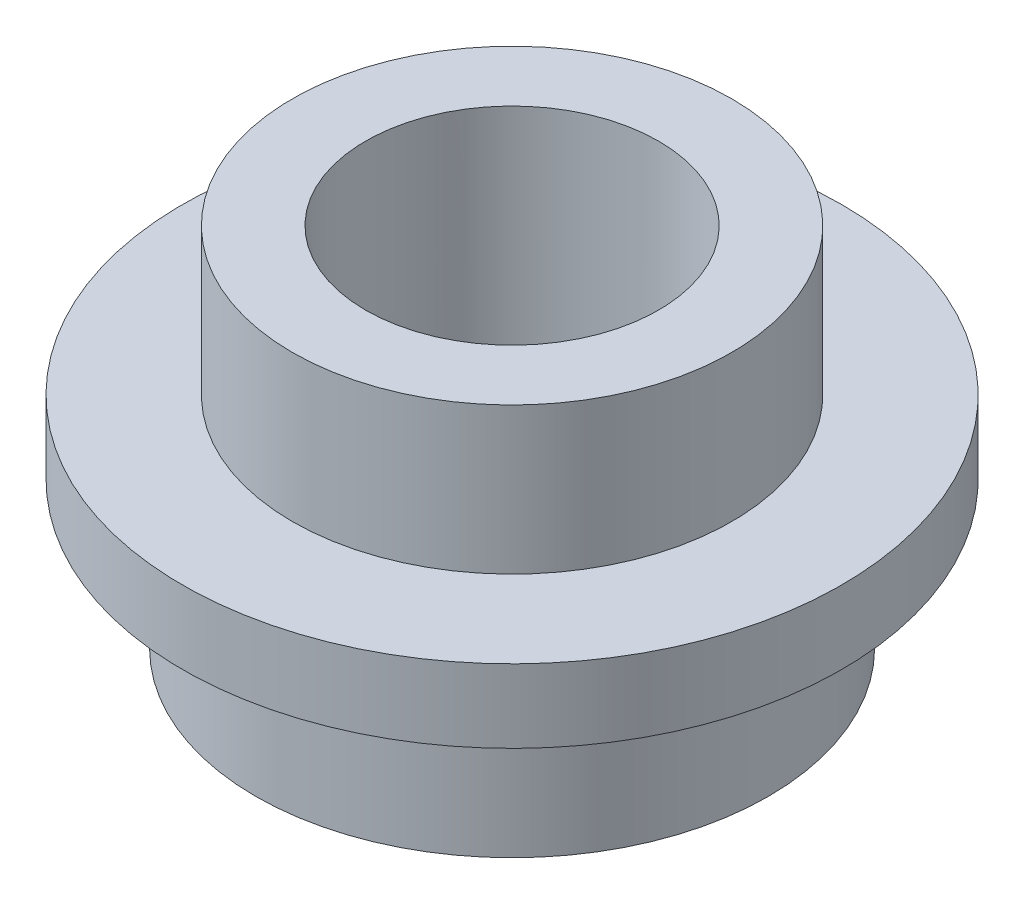
ISO-10303-21;
HEADER;
FILE_DESCRIPTION(('STEP AP214'),'2;1');
FILE_NAME('part.step','',(''),(''),'','','');
FILE_SCHEMA(('AUTOMOTIVE_DESIGN { 1 0 10303 214 1 1 1 1 }'));
ENDSEC;
DATA;
#1=APPLICATION_CONTEXT('core data for automotive mechanical design processes');
#2=APPLICATION_PROTOCOL_DEFINITION('international standard','automotive_design',2000,#1);
#3=PRODUCT_CONTEXT('',#1,'mechanical');
#4=PRODUCT('Part','Part','',(#3));
#5=PRODUCT_RELATED_PRODUCT_CATEGORY('part','',(#4));
#6=PRODUCT_DEFINITION_FORMATION('','',#4);
#7=PRODUCT_DEFINITION_CONTEXT('part definition',#1,'design');
#8=PRODUCT_DEFINITION('design','',#6,#7);
#9=PRODUCT_DEFINITION_SHAPE('','',#8);
#10=(LENGTH_UNIT() NAMED_UNIT(*) SI_UNIT(.MILLI.,.METRE.));
#11=(NAMED_UNIT(*) PLANE_ANGLE_UNIT() SI_UNIT($,.RADIAN.));
#12=(NAMED_UNIT(*) SI_UNIT($,.STERADIAN.) SOLID_ANGLE_UNIT());
#13=UNCERTAINTY_MEASURE_WITH_UNIT(LENGTH_MEASURE(1.E-05),#10,'distance_accuracy_value','');
#14=(GEOMETRIC_REPRESENTATION_CONTEXT(3) GLOBAL_UNCERTAINTY_ASSIGNED_CONTEXT((#13)) GLOBAL_UNIT_ASSIGNED_CONTEXT((#10,
#11,#12)) REPRESENTATION_CONTEXT('',''));
#15=CARTESIAN_POINT('',(0.,0.,0.));
#16=DIRECTION('',(0.,0.,1.));
#17=DIRECTION('',(1.,0.,0.));
#18=AXIS2_PLACEMENT_3D('',#15,#16,#17);
#19=CARTESIAN_POINT('',(0.,-6.35,0.));
#20=DIRECTION('',(0.,-1.,0.));
#21=DIRECTION('',(0.,0.,-1.));
#22=AXIS2_PLACEMENT_3D('',#19,#20,#21);
#23=PLANE('',#22);
#24=CARTESIAN_POINT('',(0.,-6.35,0.));
#25=DIRECTION('',(0.,-1.,0.));
#26=DIRECTION('',(0.,0.,-1.));
#27=AXIS2_PLACEMENT_3D('',#24,#25,#26);
#28=CIRCLE('',#27,12.7);
#29=CARTESIAN_POINT('',(0.,-6.35,-12.7));
#30=VERTEX_POINT('',#29);
#31=EDGE_CURVE('E49',#30,#30,#28,.T.);
#32=ORIENTED_EDGE('',*,*,#31,.F.);
#33=EDGE_LOOP('',(#32));
#34=FACE_BOUND('',#33,.T.);
#35=CARTESIAN_POINT('',(0.,-6.35,0.));
#36=DIRECTION('',(0.,-1.,0.));
#37=DIRECTION('',(0.,0.,-1.));
#38=AXIS2_PLACEMENT_3D('',#35,#36,#37);
#39=CIRCLE('',#38,15.875);
#40=CARTESIAN_POINT('',(0.,-6.35,-15.875));
#41=VERTEX_POINT('',#40);
#42=EDGE_CURVE('E176',#41,#41,#39,.T.);
#43=ORIENTED_EDGE('',*,*,#42,.T.);
#44=EDGE_LOOP('',(#43));
#45=FACE_BOUND('',#44,.T.);
#46=ADVANCED_FACE('F31',(#34,#45),#23,.T.);
#47=CARTESIAN_POINT('',(0.,12.7,0.));
#48=DIRECTION('',(0.,1.,0.));
#49=DIRECTION('',(0.,0.,1.));
#50=AXIS2_PLACEMENT_3D('',#47,#48,#49);
#51=PLANE('',#50);
#52=CARTESIAN_POINT('',(0.,12.7,0.));
#53=DIRECTION('',(0.,1.,0.));
#54=DIRECTION('',(0.,0.,1.));
#55=AXIS2_PLACEMENT_3D('',#52,#53,#54);
#56=CIRCLE('',#55,19.05);
#57=CARTESIAN_POINT('',(0.,12.7,19.05));
#58=VERTEX_POINT('',#57);
#59=EDGE_CURVE('E39',#58,#58,#56,.T.);
#60=ORIENTED_EDGE('',*,*,#59,.T.);
#61=EDGE_LOOP('',(#60));
#62=FACE_BOUND('',#61,.T.);
#63=CARTESIAN_POINT('',(0.,12.7,0.));
#64=DIRECTION('',(0.,1.,0.));
#65=DIRECTION('',(0.,0.,1.));
#66=AXIS2_PLACEMENT_3D('',#63,#64,#65);
#67=CIRCLE('',#66,12.7);
#68=CARTESIAN_POINT('',(0.,12.7,12.7));
#69=VERTEX_POINT('',#68);
#70=EDGE_CURVE('E44',#69,#69,#67,.T.);
#71=ORIENTED_EDGE('',*,*,#70,.F.);
#72=EDGE_LOOP('',(#71));
#73=FACE_BOUND('',#72,.T.);
#74=ADVANCED_FACE('F86',(#62,#73),#51,.T.);
#75=CARTESIAN_POINT('',(0.,12.7,0.));
#76=DIRECTION('',(0.,-1.,0.));
#77=DIRECTION('',(0.,0.,-1.));
#78=AXIS2_PLACEMENT_3D('',#75,#76,#77);
#79=CYLINDRICAL_SURFACE('',#78,19.05);
#80=ORIENTED_EDGE('',*,*,#59,.F.);
#81=EDGE_LOOP('',(#80));
#82=FACE_BOUND('',#81,.T.);
#83=CARTESIAN_POINT('',(0.,0.,0.));
#84=DIRECTION('',(0.,1.,0.));
#85=DIRECTION('',(0.,0.,1.));
#86=AXIS2_PLACEMENT_3D('',#83,#84,#85);
#87=CIRCLE('',#86,19.05);
#88=CARTESIAN_POINT('',(0.,0.,19.05));
#89=VERTEX_POINT('',#88);
#90=EDGE_CURVE('E35',#89,#89,#87,.T.);
#91=ORIENTED_EDGE('',*,*,#90,.T.);
#92=EDGE_LOOP('',(#91));
#93=FACE_BOUND('',#92,.T.);
#94=ADVANCED_FACE('F33',(#82,#93),#79,.T.);
#95=CARTESIAN_POINT('',(0.,12.7,0.));
#96=DIRECTION('',(0.,-1.,0.));
#97=DIRECTION('',(0.,0.,-1.));
#98=AXIS2_PLACEMENT_3D('',#95,#96,#97);
#99=CYLINDRICAL_SURFACE('',#98,12.7);
#100=ORIENTED_EDGE('',*,*,#70,.T.);
#101=EDGE_LOOP('',(#100));
#102=FACE_BOUND('',#101,.T.);
#103=ORIENTED_EDGE('',*,*,#31,.T.);
#104=EDGE_LOOP('',(#103));
#105=FACE_BOUND('',#104,.T.);
#106=ADVANCED_FACE('F97',(#102,#105),#99,.F.);
#107=CARTESIAN_POINT('',(0.,-6.35,0.));
#108=DIRECTION('',(0.,-1.,0.));
#109=DIRECTION('',(0.,0.,-1.));
#110=AXIS2_PLACEMENT_3D('',#107,#108,#109);
#111=CIRCLE('',#110,22.225);
#112=CARTESIAN_POINT('',(0.,-6.35,-22.225));
#113=VERTEX_POINT('',#112);
#114=EDGE_CURVE('E10',#113,#113,#111,.T.);
#115=ORIENTED_EDGE('',*,*,#114,.F.);
#116=EDGE_LOOP('',(#115));
#117=FACE_BOUND('',#116,.T.);
#118=CARTESIAN_POINT('',(0.,-6.35,0.));
#119=DIRECTION('',(0.,-1.,0.));
#120=DIRECTION('',(0.,0.,-1.));
#121=AXIS2_PLACEMENT_3D('',#118,#119,#120);
#122=CIRCLE('',#121,28.575);
#123=CARTESIAN_POINT('',(0.,-6.35,-28.575));
#124=VERTEX_POINT('',#123);
#125=EDGE_CURVE('E53',#124,#124,#122,.T.);
#126=ORIENTED_EDGE('',*,*,#125,.T.);
#127=EDGE_LOOP('',(#126));
#128=FACE_BOUND('',#127,.T.);
#129=ADVANCED_FACE('F69',(#117,#128),#23,.T.);
#130=CARTESIAN_POINT('',(0.,0.,0.));
#131=DIRECTION('',(0.,-1.,0.));
#132=DIRECTION('',(0.,0.,-1.));
#133=AXIS2_PLACEMENT_3D('',#130,#131,#132);
#134=PLANE('',#133);
#135=ORIENTED_EDGE('',*,*,#90,.F.);
#136=EDGE_LOOP('',(#135));
#137=FACE_BOUND('',#136,.T.);
#138=CARTESIAN_POINT('',(0.,0.,0.));
#139=DIRECTION('',(0.,-1.,0.));
#140=DIRECTION('',(0.,0.,-1.));
#141=AXIS2_PLACEMENT_3D('',#138,#139,#140);
#142=CIRCLE('',#141,28.575);
#143=CARTESIAN_POINT('',(0.,0.,-28.575));
#144=VERTEX_POINT('',#143);
#145=EDGE_CURVE('E52',#144,#144,#142,.T.);
#146=ORIENTED_EDGE('',*,*,#145,.F.);
#147=EDGE_LOOP('',(#146));
#148=FACE_BOUND('',#147,.T.);
#149=ADVANCED_FACE('F65',(#137,#148),#134,.F.);
#150=CARTESIAN_POINT('',(0.,-6.35,0.));
#151=DIRECTION('',(0.,1.,0.));
#152=DIRECTION('',(0.,0.,1.));
#153=AXIS2_PLACEMENT_3D('',#150,#151,#152);
#154=CYLINDRICAL_SURFACE('',#153,28.575);
#155=ORIENTED_EDGE('',*,*,#125,.F.);
#156=EDGE_LOOP('',(#155));
#157=FACE_BOUND('',#156,.T.);
#158=ORIENTED_EDGE('',*,*,#145,.T.);
#159=EDGE_LOOP('',(#158));
#160=FACE_BOUND('',#159,.T.);
#161=ADVANCED_FACE('F68',(#157,#160),#154,.T.);
#162=CARTESIAN_POINT('',(0.,-19.05,0.));
#163=DIRECTION('',(0.,-1.,0.));
#164=DIRECTION('',(0.,0.,-1.));
#165=AXIS2_PLACEMENT_3D('',#162,#163,#164);
#166=PLANE('',#165);
#167=CARTESIAN_POINT('',(0.,-19.05,0.));
#168=DIRECTION('',(0.,-1.,0.));
#169=DIRECTION('',(0.,0.,-1.));
#170=AXIS2_PLACEMENT_3D('',#167,#168,#169);
#171=CIRCLE('',#170,22.225);
#172=CARTESIAN_POINT('',(0.,-19.05,-22.225));
#173=VERTEX_POINT('',#172);
#174=EDGE_CURVE('E47',#173,#173,#171,.T.);
#175=ORIENTED_EDGE('',*,*,#174,.T.);
#176=EDGE_LOOP('',(#175));
#177=FACE_BOUND('',#176,.T.);
#178=CARTESIAN_POINT('',(0.,-19.05,0.));
#179=DIRECTION('',(0.,-1.,0.));
#180=DIRECTION('',(0.,0.,-1.));
#181=AXIS2_PLACEMENT_3D('',#178,#179,#180);
#182=CIRCLE('',#181,15.875);
#183=CARTESIAN_POINT('',(0.,-19.05,-15.875));
#184=VERTEX_POINT('',#183);
#185=EDGE_CURVE('E173',#184,#184,#182,.T.);
#186=ORIENTED_EDGE('',*,*,#185,.F.);
#187=EDGE_LOOP('',(#186));
#188=FACE_BOUND('',#187,.T.);
#189=ADVANCED_FACE('F74',(#177,#188),#166,.T.);
#190=CARTESIAN_POINT('',(0.,-19.05,0.));
#191=DIRECTION('',(0.,1.,0.));
#192=DIRECTION('',(0.,0.,1.));
#193=AXIS2_PLACEMENT_3D('',#190,#191,#192);
#194=CYLINDRICAL_SURFACE('',#193,22.225);
#195=ORIENTED_EDGE('',*,*,#174,.F.);
#196=EDGE_LOOP('',(#195));
#197=FACE_BOUND('',#196,.T.);
#198=ORIENTED_EDGE('',*,*,#114,.T.);
#199=EDGE_LOOP('',(#198));
#200=FACE_BOUND('',#199,.T.);
#201=ADVANCED_FACE('F80',(#197,#200),#194,.T.);
#202=CARTESIAN_POINT('',(0.,-19.05,0.));
#203=DIRECTION('',(0.,1.,0.));
#204=DIRECTION('',(0.,0.,1.));
#205=AXIS2_PLACEMENT_3D('',#202,#203,#204);
#206=CYLINDRICAL_SURFACE('',#205,15.875);
#207=ORIENTED_EDGE('',*,*,#185,.T.);
#208=EDGE_LOOP('',(#207));
#209=FACE_BOUND('',#208,.T.);
#210=ORIENTED_EDGE('',*,*,#42,.F.);
#211=EDGE_LOOP('',(#210));
#212=FACE_BOUND('',#211,.T.);
#213=ADVANCED_FACE('F157',(#209,#212),#206,.F.);
#214=CLOSED_SHELL('',(#46,#74,#94,#106,#129,#149,#161,#189,#201,#213));
#215=MANIFOLD_SOLID_BREP('B2',#214);
#216=ADVANCED_BREP_SHAPE_REPRESENTATION('',(#18,#215),#14);
#217=SHAPE_DEFINITION_REPRESENTATION(#9,#216);
ENDSEC;
END-ISO-10303-21;
